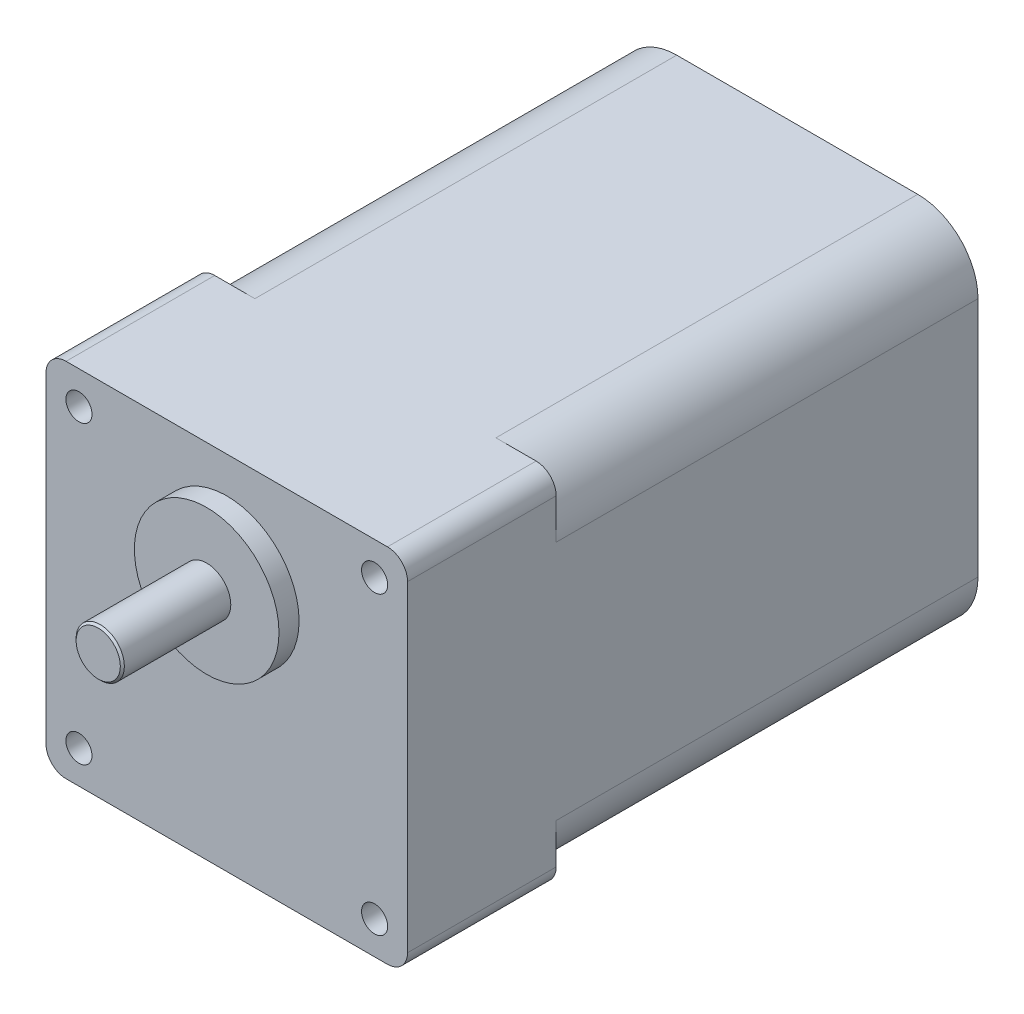
ISO-10303-21;
HEADER;
FILE_DESCRIPTION(('STEP AP214'),'2;1');
FILE_NAME('part.step','',(''),(''),'','','');
FILE_SCHEMA(('AUTOMOTIVE_DESIGN { 1 0 10303 214 1 1 1 1 }'));
ENDSEC;
DATA;
#1=APPLICATION_CONTEXT('core data for automotive mechanical design processes');
#2=APPLICATION_PROTOCOL_DEFINITION('international standard','automotive_design',2000,#1);
#3=PRODUCT_CONTEXT('',#1,'mechanical');
#4=PRODUCT('Part','Part','',(#3));
#5=PRODUCT_RELATED_PRODUCT_CATEGORY('part','',(#4));
#6=PRODUCT_DEFINITION_FORMATION('','',#4);
#7=PRODUCT_DEFINITION_CONTEXT('part definition',#1,'design');
#8=PRODUCT_DEFINITION('design','',#6,#7);
#9=PRODUCT_DEFINITION_SHAPE('','',#8);
#10=(LENGTH_UNIT() NAMED_UNIT(*) SI_UNIT(.MILLI.,.METRE.));
#11=(NAMED_UNIT(*) PLANE_ANGLE_UNIT() SI_UNIT($,.RADIAN.));
#12=(NAMED_UNIT(*) SI_UNIT($,.STERADIAN.) SOLID_ANGLE_UNIT());
#13=UNCERTAINTY_MEASURE_WITH_UNIT(LENGTH_MEASURE(1.E-05),#10,'distance_accuracy_value','');
#14=(GEOMETRIC_REPRESENTATION_CONTEXT(3) GLOBAL_UNCERTAINTY_ASSIGNED_CONTEXT((#13)) GLOBAL_UNIT_ASSIGNED_CONTEXT((#10,
#11,#12)) REPRESENTATION_CONTEXT('',''));
#15=CARTESIAN_POINT('',(0.,0.,0.));
#16=DIRECTION('',(0.,0.,1.));
#17=DIRECTION('',(1.,0.,0.));
#18=AXIS2_PLACEMENT_3D('',#15,#16,#17);
#19=CARTESIAN_POINT('',(0.,0.,0.));
#20=DIRECTION('',(0.,0.,1.));
#21=DIRECTION('',(1.,0.,0.));
#22=AXIS2_PLACEMENT_3D('',#19,#20,#21);
#23=PLANE('',#22);
#24=CARTESIAN_POINT('',(30.,30.,0.));
#25=DIRECTION('',(0.,0.,-1.));
#26=DIRECTION('',(-1.,0.,0.));
#27=AXIS2_PLACEMENT_3D('',#24,#25,#26);
#28=CIRCLE('',#27,15.);
#29=CARTESIAN_POINT('',(30.,45.,0.));
#30=VERTEX_POINT('',#29);
#31=CARTESIAN_POINT('',(45.,30.,0.));
#32=VERTEX_POINT('',#31);
#33=EDGE_CURVE('E58',#30,#32,#28,.T.);
#34=ORIENTED_EDGE('',*,*,#33,.F.);
#35=DIRECTION('',(-1.,0.,0.));
#36=VECTOR('',#35,1.);
#37=CARTESIAN_POINT('',(-45.,45.,0.));
#38=LINE('',#37,#36);
#39=CARTESIAN_POINT('',(40.,45.,0.));
#40=VERTEX_POINT('',#39);
#41=EDGE_CURVE('E257',#40,#30,#38,.T.);
#42=ORIENTED_EDGE('',*,*,#41,.F.);
#43=CARTESIAN_POINT('',(40.,40.,0.));
#44=DIRECTION('',(0.,0.,1.));
#45=DIRECTION('',(1.,0.,0.));
#46=AXIS2_PLACEMENT_3D('',#43,#44,#45);
#47=CIRCLE('',#46,5.);
#48=CARTESIAN_POINT('',(45.,40.,0.));
#49=VERTEX_POINT('',#48);
#50=EDGE_CURVE('E274',#40,#49,#47,.F.);
#51=ORIENTED_EDGE('',*,*,#50,.T.);
#52=DIRECTION('',(0.,1.,0.));
#53=VECTOR('',#52,1.);
#54=CARTESIAN_POINT('',(45.,45.,0.));
#55=LINE('',#54,#53);
#56=EDGE_CURVE('E245',#32,#49,#55,.T.);
#57=ORIENTED_EDGE('',*,*,#56,.F.);
#58=EDGE_LOOP('',(#34,#42,#51,#57));
#59=FACE_BOUND('',#58,.T.);
#60=ADVANCED_FACE('F35',(#59),#23,.F.);
#61=CARTESIAN_POINT('',(-30.,30.,0.));
#62=DIRECTION('',(0.,0.,-1.));
#63=DIRECTION('',(-1.,0.,0.));
#64=AXIS2_PLACEMENT_3D('',#61,#62,#63);
#65=CIRCLE('',#64,15.);
#66=CARTESIAN_POINT('',(-45.,30.,0.));
#67=VERTEX_POINT('',#66);
#68=CARTESIAN_POINT('',(-30.,45.,0.));
#69=VERTEX_POINT('',#68);
#70=EDGE_CURVE('E170',#67,#69,#65,.T.);
#71=ORIENTED_EDGE('',*,*,#70,.F.);
#72=DIRECTION('',(0.,-1.,0.));
#73=VECTOR('',#72,1.);
#74=CARTESIAN_POINT('',(-45.,45.,0.));
#75=LINE('',#74,#73);
#76=CARTESIAN_POINT('',(-45.,40.,0.));
#77=VERTEX_POINT('',#76);
#78=EDGE_CURVE('E261',#77,#67,#75,.T.);
#79=ORIENTED_EDGE('',*,*,#78,.F.);
#80=CARTESIAN_POINT('',(-40.,40.,0.));
#81=DIRECTION('',(0.,0.,1.));
#82=DIRECTION('',(1.,0.,0.));
#83=AXIS2_PLACEMENT_3D('',#80,#81,#82);
#84=CIRCLE('',#83,5.);
#85=CARTESIAN_POINT('',(-40.,45.,0.));
#86=VERTEX_POINT('',#85);
#87=EDGE_CURVE('E277',#77,#86,#84,.F.);
#88=ORIENTED_EDGE('',*,*,#87,.T.);
#89=EDGE_CURVE('E50',#69,#86,#38,.T.);
#90=ORIENTED_EDGE('',*,*,#89,.F.);
#91=EDGE_LOOP('',(#71,#79,#88,#90));
#92=FACE_BOUND('',#91,.T.);
#93=ADVANCED_FACE('F419',(#92),#23,.F.);
#94=CARTESIAN_POINT('',(-30.,-30.,0.));
#95=DIRECTION('',(0.,0.,-1.));
#96=DIRECTION('',(-1.,0.,0.));
#97=AXIS2_PLACEMENT_3D('',#94,#95,#96);
#98=CIRCLE('',#97,15.);
#99=CARTESIAN_POINT('',(-30.,-45.,0.));
#100=VERTEX_POINT('',#99);
#101=CARTESIAN_POINT('',(-45.,-30.,0.));
#102=VERTEX_POINT('',#101);
#103=EDGE_CURVE('E203',#100,#102,#98,.T.);
#104=ORIENTED_EDGE('',*,*,#103,.F.);
#105=DIRECTION('',(1.,0.,0.));
#106=VECTOR('',#105,1.);
#107=CARTESIAN_POINT('',(-45.,-45.,0.));
#108=LINE('',#107,#106);
#109=CARTESIAN_POINT('',(-40.,-45.,0.));
#110=VERTEX_POINT('',#109);
#111=EDGE_CURVE('E265',#110,#100,#108,.T.);
#112=ORIENTED_EDGE('',*,*,#111,.F.);
#113=CARTESIAN_POINT('',(-40.,-40.,0.));
#114=DIRECTION('',(0.,0.,1.));
#115=DIRECTION('',(1.,0.,0.));
#116=AXIS2_PLACEMENT_3D('',#113,#114,#115);
#117=CIRCLE('',#116,5.);
#118=CARTESIAN_POINT('',(-45.,-40.,0.));
#119=VERTEX_POINT('',#118);
#120=EDGE_CURVE('E279',#110,#119,#117,.F.);
#121=ORIENTED_EDGE('',*,*,#120,.T.);
#122=EDGE_CURVE('E259',#102,#119,#75,.T.);
#123=ORIENTED_EDGE('',*,*,#122,.F.);
#124=EDGE_LOOP('',(#104,#112,#121,#123));
#125=FACE_BOUND('',#124,.T.);
#126=ADVANCED_FACE('F322',(#125),#23,.F.);
#127=CARTESIAN_POINT('',(30.,-30.,0.));
#128=DIRECTION('',(0.,0.,-1.));
#129=DIRECTION('',(-1.,0.,0.));
#130=AXIS2_PLACEMENT_3D('',#127,#128,#129);
#131=CIRCLE('',#130,15.);
#132=CARTESIAN_POINT('',(45.,-30.,0.));
#133=VERTEX_POINT('',#132);
#134=CARTESIAN_POINT('',(29.9999999999983,-45.,0.));
#135=VERTEX_POINT('',#134);
#136=EDGE_CURVE('E187',#133,#135,#131,.T.);
#137=ORIENTED_EDGE('',*,*,#136,.F.);
#138=CARTESIAN_POINT('',(45.,-40.,0.));
#139=VERTEX_POINT('',#138);
#140=EDGE_CURVE('E242',#139,#133,#55,.T.);
#141=ORIENTED_EDGE('',*,*,#140,.F.);
#142=CARTESIAN_POINT('',(40.,-40.,0.));
#143=DIRECTION('',(0.,0.,1.));
#144=DIRECTION('',(1.,0.,0.));
#145=AXIS2_PLACEMENT_3D('',#142,#143,#144);
#146=CIRCLE('',#145,5.);
#147=CARTESIAN_POINT('',(40.,-45.,0.));
#148=VERTEX_POINT('',#147);
#149=EDGE_CURVE('E282',#139,#148,#146,.F.);
#150=ORIENTED_EDGE('',*,*,#149,.T.);
#151=EDGE_CURVE('E264',#135,#148,#108,.T.);
#152=ORIENTED_EDGE('',*,*,#151,.F.);
#153=EDGE_LOOP('',(#137,#141,#150,#152));
#154=FACE_BOUND('',#153,.T.);
#155=ADVANCED_FACE('F421',(#154),#23,.F.);
#156=CARTESIAN_POINT('',(0.,18.,42.));
#157=DIRECTION('',(0.,0.,1.));
#158=DIRECTION('',(1.,0.,0.));
#159=AXIS2_PLACEMENT_3D('',#156,#157,#158);
#160=PLANE('',#159);
#161=CARTESIAN_POINT('',(0.,18.,42.));
#162=DIRECTION('',(0.,0.,1.));
#163=DIRECTION('',(1.,0.,0.));
#164=AXIS2_PLACEMENT_3D('',#161,#162,#163);
#165=CIRCLE('',#164,18.);
#166=CARTESIAN_POINT('',(18.,18.,42.));
#167=VERTEX_POINT('',#166);
#168=EDGE_CURVE('E331',#167,#167,#165,.T.);
#169=ORIENTED_EDGE('',*,*,#168,.T.);
#170=EDGE_LOOP('',(#169));
#171=FACE_BOUND('',#170,.T.);
#172=CARTESIAN_POINT('',(0.,18.,42.));
#173=DIRECTION('',(0.,0.,1.));
#174=DIRECTION('',(1.,0.,0.));
#175=AXIS2_PLACEMENT_3D('',#172,#173,#174);
#176=CIRCLE('',#175,6.);
#177=CARTESIAN_POINT('',(6.,18.,42.));
#178=VERTEX_POINT('',#177);
#179=EDGE_CURVE('E173',#178,#178,#176,.T.);
#180=ORIENTED_EDGE('',*,*,#179,.F.);
#181=EDGE_LOOP('',(#180));
#182=FACE_BOUND('',#181,.T.);
#183=ADVANCED_FACE('F395',(#171,#182),#160,.T.);
#184=CARTESIAN_POINT('',(0.,0.,37.));
#185=DIRECTION('',(0.,0.,1.));
#186=DIRECTION('',(1.,0.,0.));
#187=AXIS2_PLACEMENT_3D('',#184,#185,#186);
#188=PLANE('',#187);
#189=CARTESIAN_POINT('',(-36.7999999999979,-36.8,37.));
#190=DIRECTION('',(0.,0.,1.));
#191=DIRECTION('',(1.,0.,0.));
#192=AXIS2_PLACEMENT_3D('',#189,#190,#191);
#193=CIRCLE('',#192,3.2500000000011);
#194=CARTESIAN_POINT('',(-33.5499999999968,-36.8,37.));
#195=VERTEX_POINT('',#194);
#196=EDGE_CURVE('E378',#195,#195,#193,.T.);
#197=ORIENTED_EDGE('',*,*,#196,.F.);
#198=EDGE_LOOP('',(#197));
#199=FACE_BOUND('',#198,.T.);
#200=CARTESIAN_POINT('',(36.8000000000021,-36.7999999999979,37.));
#201=DIRECTION('',(0.,0.,1.));
#202=DIRECTION('',(1.,0.,0.));
#203=AXIS2_PLACEMENT_3D('',#200,#201,#202);
#204=CIRCLE('',#203,3.25000000000292);
#205=CARTESIAN_POINT('',(40.050000000005,-36.7999999999979,37.));
#206=VERTEX_POINT('',#205);
#207=EDGE_CURVE('E372',#206,#206,#204,.T.);
#208=ORIENTED_EDGE('',*,*,#207,.F.);
#209=EDGE_LOOP('',(#208));
#210=FACE_BOUND('',#209,.T.);
#211=CARTESIAN_POINT('',(36.8,36.8000000000021,37.));
#212=DIRECTION('',(0.,0.,1.));
#213=DIRECTION('',(1.,0.,0.));
#214=AXIS2_PLACEMENT_3D('',#211,#212,#213);
#215=CIRCLE('',#214,3.25000000000214);
#216=CARTESIAN_POINT('',(40.0500000000021,36.8000000000021,37.));
#217=VERTEX_POINT('',#216);
#218=EDGE_CURVE('E366',#217,#217,#215,.T.);
#219=ORIENTED_EDGE('',*,*,#218,.F.);
#220=EDGE_LOOP('',(#219));
#221=FACE_BOUND('',#220,.T.);
#222=CARTESIAN_POINT('',(-36.8,36.8,37.));
#223=DIRECTION('',(0.,0.,1.));
#224=DIRECTION('',(1.,0.,0.));
#225=AXIS2_PLACEMENT_3D('',#222,#223,#224);
#226=CIRCLE('',#225,3.25);
#227=CARTESIAN_POINT('',(-33.55,36.8,37.));
#228=VERTEX_POINT('',#227);
#229=EDGE_CURVE('E360',#228,#228,#226,.T.);
#230=ORIENTED_EDGE('',*,*,#229,.F.);
#231=EDGE_LOOP('',(#230));
#232=FACE_BOUND('',#231,.T.);
#233=DIRECTION('',(1.,0.,0.));
#234=VECTOR('',#233,1.);
#235=CARTESIAN_POINT('',(-45.,-45.,37.));
#236=LINE('',#235,#234);
#237=CARTESIAN_POINT('',(-40.,-45.,37.));
#238=VERTEX_POINT('',#237);
#239=CARTESIAN_POINT('',(40.,-45.,37.));
#240=VERTEX_POINT('',#239);
#241=EDGE_CURVE('E249',#238,#240,#236,.T.);
#242=ORIENTED_EDGE('',*,*,#241,.T.);
#243=CARTESIAN_POINT('',(40.,-40.,37.));
#244=DIRECTION('',(0.,0.,1.));
#245=DIRECTION('',(1.,0.,0.));
#246=AXIS2_PLACEMENT_3D('',#243,#244,#245);
#247=CIRCLE('',#246,5.);
#248=CARTESIAN_POINT('',(45.,-40.,37.));
#249=VERTEX_POINT('',#248);
#250=EDGE_CURVE('E296',#240,#249,#247,.T.);
#251=ORIENTED_EDGE('',*,*,#250,.T.);
#252=DIRECTION('',(0.,1.,0.));
#253=VECTOR('',#252,1.);
#254=CARTESIAN_POINT('',(45.,45.,37.));
#255=LINE('',#254,#253);
#256=CARTESIAN_POINT('',(45.,40.,37.));
#257=VERTEX_POINT('',#256);
#258=EDGE_CURVE('E323',#249,#257,#255,.T.);
#259=ORIENTED_EDGE('',*,*,#258,.T.);
#260=CARTESIAN_POINT('',(40.,40.,37.));
#261=DIRECTION('',(0.,0.,1.));
#262=DIRECTION('',(1.,0.,0.));
#263=AXIS2_PLACEMENT_3D('',#260,#261,#262);
#264=CIRCLE('',#263,5.);
#265=CARTESIAN_POINT('',(40.,45.,37.));
#266=VERTEX_POINT('',#265);
#267=EDGE_CURVE('E290',#257,#266,#264,.T.);
#268=ORIENTED_EDGE('',*,*,#267,.T.);
#269=DIRECTION('',(-1.,0.,0.));
#270=VECTOR('',#269,1.);
#271=CARTESIAN_POINT('',(-45.,45.,37.));
#272=LINE('',#271,#270);
#273=CARTESIAN_POINT('',(-40.,45.,37.));
#274=VERTEX_POINT('',#273);
#275=EDGE_CURVE('E315',#266,#274,#272,.T.);
#276=ORIENTED_EDGE('',*,*,#275,.T.);
#277=CARTESIAN_POINT('',(-40.,40.,37.));
#278=DIRECTION('',(0.,0.,1.));
#279=DIRECTION('',(1.,0.,0.));
#280=AXIS2_PLACEMENT_3D('',#277,#278,#279);
#281=CIRCLE('',#280,5.);
#282=CARTESIAN_POINT('',(-45.,40.,37.));
#283=VERTEX_POINT('',#282);
#284=EDGE_CURVE('E292',#274,#283,#281,.T.);
#285=ORIENTED_EDGE('',*,*,#284,.T.);
#286=DIRECTION('',(0.,-1.,0.));
#287=VECTOR('',#286,1.);
#288=CARTESIAN_POINT('',(-45.,45.,37.));
#289=LINE('',#288,#287);
#290=CARTESIAN_POINT('',(-45.,-40.,37.));
#291=VERTEX_POINT('',#290);
#292=EDGE_CURVE('E305',#283,#291,#289,.T.);
#293=ORIENTED_EDGE('',*,*,#292,.T.);
#294=CARTESIAN_POINT('',(-40.,-40.,37.));
#295=DIRECTION('',(0.,0.,1.));
#296=DIRECTION('',(1.,0.,0.));
#297=AXIS2_PLACEMENT_3D('',#294,#295,#296);
#298=CIRCLE('',#297,5.);
#299=EDGE_CURVE('E294',#291,#238,#298,.T.);
#300=ORIENTED_EDGE('',*,*,#299,.T.);
#301=EDGE_LOOP('',(#242,#251,#259,#268,#276,#285,#293,#300));
#302=FACE_BOUND('',#301,.T.);
#303=CARTESIAN_POINT('',(0.,18.,37.));
#304=DIRECTION('',(0.,0.,1.));
#305=DIRECTION('',(1.,0.,0.));
#306=AXIS2_PLACEMENT_3D('',#303,#304,#305);
#307=CIRCLE('',#306,18.);
#308=CARTESIAN_POINT('',(18.,18.,37.));
#309=VERTEX_POINT('',#308);
#310=EDGE_CURVE('E176',#309,#309,#307,.T.);
#311=ORIENTED_EDGE('',*,*,#310,.F.);
#312=EDGE_LOOP('',(#311));
#313=FACE_BOUND('',#312,.T.);
#314=ADVANCED_FACE('F311',(#199,#210,#221,#232,#302,#313),#188,.T.);
#315=CARTESIAN_POINT('',(45.,45.,37.));
#316=DIRECTION('',(-1.,0.,0.));
#317=DIRECTION('',(0.,-1.,0.));
#318=AXIS2_PLACEMENT_3D('',#315,#316,#317);
#319=PLANE('',#318);
#320=ORIENTED_EDGE('',*,*,#258,.F.);
#321=DIRECTION('',(0.,0.,-1.));
#322=VECTOR('',#321,1.);
#323=CARTESIAN_POINT('',(45.,-40.,37.));
#324=LINE('',#323,#322);
#325=EDGE_CURVE('E271',#249,#139,#324,.T.);
#326=ORIENTED_EDGE('',*,*,#325,.T.);
#327=ORIENTED_EDGE('',*,*,#140,.T.);
#328=DIRECTION('',(0.,0.,1.));
#329=VECTOR('',#328,1.);
#330=CARTESIAN_POINT('',(45.,-30.0000000000002,-105.));
#331=LINE('',#330,#329);
#332=CARTESIAN_POINT('',(45.,-30.0000000000002,-105.));
#333=VERTEX_POINT('',#332);
#334=EDGE_CURVE('E157',#333,#133,#331,.T.);
#335=ORIENTED_EDGE('',*,*,#334,.F.);
#336=DIRECTION('',(0.,-1.,0.));
#337=VECTOR('',#336,1.);
#338=CARTESIAN_POINT('',(45.,29.9999999999986,-105.));
#339=LINE('',#338,#337);
#340=CARTESIAN_POINT('',(45.,29.9999999999986,-105.));
#341=VERTEX_POINT('',#340);
#342=EDGE_CURVE('E149',#341,#333,#339,.T.);
#343=ORIENTED_EDGE('',*,*,#342,.F.);
#344=DIRECTION('',(0.,0.,1.));
#345=VECTOR('',#344,1.);
#346=CARTESIAN_POINT('',(45.,29.9999999999986,-105.));
#347=LINE('',#346,#345);
#348=EDGE_CURVE('E154',#341,#32,#347,.T.);
#349=ORIENTED_EDGE('',*,*,#348,.T.);
#350=ORIENTED_EDGE('',*,*,#56,.T.);
#351=DIRECTION('',(0.,0.,-1.));
#352=VECTOR('',#351,1.);
#353=CARTESIAN_POINT('',(45.,40.,37.));
#354=LINE('',#353,#352);
#355=EDGE_CURVE('E268',#49,#257,#354,.F.);
#356=ORIENTED_EDGE('',*,*,#355,.T.);
#357=EDGE_LOOP('',(#320,#326,#327,#335,#343,#349,#350,#356));
#358=FACE_BOUND('',#357,.T.);
#359=ADVANCED_FACE('F152',(#358),#319,.F.);
#360=CARTESIAN_POINT('',(-45.,45.,37.));
#361=DIRECTION('',(0.,-1.,0.));
#362=DIRECTION('',(0.,0.,-1.));
#363=AXIS2_PLACEMENT_3D('',#360,#361,#362);
#364=PLANE('',#363);
#365=ORIENTED_EDGE('',*,*,#41,.T.);
#366=DIRECTION('',(0.,0.,1.));
#367=VECTOR('',#366,1.);
#368=CARTESIAN_POINT('',(30.,45.,-105.));
#369=LINE('',#368,#367);
#370=CARTESIAN_POINT('',(30.,45.,-105.));
#371=VERTEX_POINT('',#370);
#372=EDGE_CURVE('E189',#371,#30,#369,.T.);
#373=ORIENTED_EDGE('',*,*,#372,.F.);
#374=DIRECTION('',(1.,0.,0.));
#375=VECTOR('',#374,1.);
#376=CARTESIAN_POINT('',(30.,45.,-105.));
#377=LINE('',#376,#375);
#378=CARTESIAN_POINT('',(-29.9999999999986,45.,-105.));
#379=VERTEX_POINT('',#378);
#380=EDGE_CURVE('E166',#379,#371,#377,.T.);
#381=ORIENTED_EDGE('',*,*,#380,.F.);
#382=DIRECTION('',(0.,0.,1.));
#383=VECTOR('',#382,1.);
#384=CARTESIAN_POINT('',(-29.9999999999986,45.,-105.));
#385=LINE('',#384,#383);
#386=EDGE_CURVE('E337',#379,#69,#385,.T.);
#387=ORIENTED_EDGE('',*,*,#386,.T.);
#388=ORIENTED_EDGE('',*,*,#89,.T.);
#389=DIRECTION('',(0.,0.,-1.));
#390=VECTOR('',#389,1.);
#391=CARTESIAN_POINT('',(-40.,45.,37.));
#392=LINE('',#391,#390);
#393=EDGE_CURVE('E228',#86,#274,#392,.F.);
#394=ORIENTED_EDGE('',*,*,#393,.T.);
#395=ORIENTED_EDGE('',*,*,#275,.F.);
#396=DIRECTION('',(0.,0.,-1.));
#397=VECTOR('',#396,1.);
#398=CARTESIAN_POINT('',(40.,45.,37.));
#399=LINE('',#398,#397);
#400=EDGE_CURVE('E231',#266,#40,#399,.T.);
#401=ORIENTED_EDGE('',*,*,#400,.T.);
#402=EDGE_LOOP('',(#365,#373,#381,#387,#388,#394,#395,#401));
#403=FACE_BOUND('',#402,.T.);
#404=ADVANCED_FACE('F485',(#403),#364,.F.);
#405=CARTESIAN_POINT('',(-45.,45.,37.));
#406=DIRECTION('',(1.,0.,0.));
#407=DIRECTION('',(0.,1.,0.));
#408=AXIS2_PLACEMENT_3D('',#405,#406,#407);
#409=PLANE('',#408);
#410=ORIENTED_EDGE('',*,*,#78,.T.);
#411=DIRECTION('',(0.,0.,1.));
#412=VECTOR('',#411,1.);
#413=CARTESIAN_POINT('',(-45.,30.0000000000002,-105.));
#414=LINE('',#413,#412);
#415=CARTESIAN_POINT('',(-45.,30.0000000000002,-105.));
#416=VERTEX_POINT('',#415);
#417=EDGE_CURVE('E221',#416,#67,#414,.T.);
#418=ORIENTED_EDGE('',*,*,#417,.F.);
#419=DIRECTION('',(0.,1.,0.));
#420=VECTOR('',#419,1.);
#421=CARTESIAN_POINT('',(-45.,30.0000000000002,-105.));
#422=LINE('',#421,#420);
#423=CARTESIAN_POINT('',(-45.,-29.9999999999986,-105.));
#424=VERTEX_POINT('',#423);
#425=EDGE_CURVE('E350',#424,#416,#422,.T.);
#426=ORIENTED_EDGE('',*,*,#425,.F.);
#427=DIRECTION('',(0.,0.,1.));
#428=VECTOR('',#427,1.);
#429=CARTESIAN_POINT('',(-45.,-29.9999999999986,-105.));
#430=LINE('',#429,#428);
#431=EDGE_CURVE('E214',#424,#102,#430,.T.);
#432=ORIENTED_EDGE('',*,*,#431,.T.);
#433=ORIENTED_EDGE('',*,*,#122,.T.);
#434=DIRECTION('',(0.,0.,-1.));
#435=VECTOR('',#434,1.);
#436=CARTESIAN_POINT('',(-45.,-40.,37.));
#437=LINE('',#436,#435);
#438=EDGE_CURVE('E238',#119,#291,#437,.F.);
#439=ORIENTED_EDGE('',*,*,#438,.T.);
#440=ORIENTED_EDGE('',*,*,#292,.F.);
#441=DIRECTION('',(0.,0.,-1.));
#442=VECTOR('',#441,1.);
#443=CARTESIAN_POINT('',(-45.,40.,37.));
#444=LINE('',#443,#442);
#445=EDGE_CURVE('E298',#283,#77,#444,.T.);
#446=ORIENTED_EDGE('',*,*,#445,.T.);
#447=EDGE_LOOP('',(#410,#418,#426,#432,#433,#439,#440,#446));
#448=FACE_BOUND('',#447,.T.);
#449=ADVANCED_FACE('F304',(#448),#409,.F.);
#450=CARTESIAN_POINT('',(-45.,-45.,37.));
#451=DIRECTION('',(0.,1.,0.));
#452=DIRECTION('',(0.,0.,1.));
#453=AXIS2_PLACEMENT_3D('',#450,#451,#452);
#454=PLANE('',#453);
#455=ORIENTED_EDGE('',*,*,#111,.T.);
#456=DIRECTION('',(0.,0.,1.));
#457=VECTOR('',#456,1.);
#458=CARTESIAN_POINT('',(-30.0000000000002,-45.,-105.));
#459=LINE('',#458,#457);
#460=CARTESIAN_POINT('',(-30.0000000000002,-45.,-105.));
#461=VERTEX_POINT('',#460);
#462=EDGE_CURVE('E208',#461,#100,#459,.T.);
#463=ORIENTED_EDGE('',*,*,#462,.F.);
#464=DIRECTION('',(-1.,0.,0.));
#465=VECTOR('',#464,1.);
#466=CARTESIAN_POINT('',(29.9999999999983,-45.,-105.));
#467=LINE('',#466,#465);
#468=CARTESIAN_POINT('',(29.9999999999983,-45.,-105.));
#469=VERTEX_POINT('',#468);
#470=EDGE_CURVE('E355',#469,#461,#467,.T.);
#471=ORIENTED_EDGE('',*,*,#470,.F.);
#472=DIRECTION('',(0.,0.,1.));
#473=VECTOR('',#472,1.);
#474=CARTESIAN_POINT('',(29.9999999999983,-45.,-105.));
#475=LINE('',#474,#473);
#476=EDGE_CURVE('E178',#469,#135,#475,.T.);
#477=ORIENTED_EDGE('',*,*,#476,.T.);
#478=ORIENTED_EDGE('',*,*,#151,.T.);
#479=DIRECTION('',(0.,0.,-1.));
#480=VECTOR('',#479,1.);
#481=CARTESIAN_POINT('',(40.,-45.,37.));
#482=LINE('',#481,#480);
#483=EDGE_CURVE('E288',#148,#240,#482,.F.);
#484=ORIENTED_EDGE('',*,*,#483,.T.);
#485=ORIENTED_EDGE('',*,*,#241,.F.);
#486=DIRECTION('',(0.,0.,-1.));
#487=VECTOR('',#486,1.);
#488=CARTESIAN_POINT('',(-40.,-45.,37.));
#489=LINE('',#488,#487);
#490=EDGE_CURVE('E285',#238,#110,#489,.T.);
#491=ORIENTED_EDGE('',*,*,#490,.T.);
#492=EDGE_LOOP('',(#455,#463,#471,#477,#478,#484,#485,#491));
#493=FACE_BOUND('',#492,.T.);
#494=ADVANCED_FACE('F320',(#493),#454,.F.);
#495=CARTESIAN_POINT('',(40.,-40.,37.));
#496=DIRECTION('',(0.,0.,-1.));
#497=DIRECTION('',(-1.,0.,0.));
#498=AXIS2_PLACEMENT_3D('',#495,#496,#497);
#499=CYLINDRICAL_SURFACE('',#498,5.);
#500=ORIENTED_EDGE('',*,*,#250,.F.);
#501=ORIENTED_EDGE('',*,*,#483,.F.);
#502=ORIENTED_EDGE('',*,*,#149,.F.);
#503=ORIENTED_EDGE('',*,*,#325,.F.);
#504=EDGE_LOOP('',(#500,#501,#502,#503));
#505=FACE_BOUND('',#504,.T.);
#506=ADVANCED_FACE('F479',(#505),#499,.T.);
#507=CARTESIAN_POINT('',(-40.,-40.,37.));
#508=DIRECTION('',(0.,0.,-1.));
#509=DIRECTION('',(-1.,0.,0.));
#510=AXIS2_PLACEMENT_3D('',#507,#508,#509);
#511=CYLINDRICAL_SURFACE('',#510,5.);
#512=ORIENTED_EDGE('',*,*,#299,.F.);
#513=ORIENTED_EDGE('',*,*,#438,.F.);
#514=ORIENTED_EDGE('',*,*,#120,.F.);
#515=ORIENTED_EDGE('',*,*,#490,.F.);
#516=EDGE_LOOP('',(#512,#513,#514,#515));
#517=FACE_BOUND('',#516,.T.);
#518=ADVANCED_FACE('F317',(#517),#511,.T.);
#519=CARTESIAN_POINT('',(-40.,40.,37.));
#520=DIRECTION('',(0.,0.,-1.));
#521=DIRECTION('',(-1.,0.,0.));
#522=AXIS2_PLACEMENT_3D('',#519,#520,#521);
#523=CYLINDRICAL_SURFACE('',#522,5.);
#524=ORIENTED_EDGE('',*,*,#284,.F.);
#525=ORIENTED_EDGE('',*,*,#393,.F.);
#526=ORIENTED_EDGE('',*,*,#87,.F.);
#527=ORIENTED_EDGE('',*,*,#445,.F.);
#528=EDGE_LOOP('',(#524,#525,#526,#527));
#529=FACE_BOUND('',#528,.T.);
#530=ADVANCED_FACE('F463',(#529),#523,.T.);
#531=CARTESIAN_POINT('',(40.,40.,37.));
#532=DIRECTION('',(0.,0.,-1.));
#533=DIRECTION('',(-1.,0.,0.));
#534=AXIS2_PLACEMENT_3D('',#531,#532,#533);
#535=CYLINDRICAL_SURFACE('',#534,5.);
#536=ORIENTED_EDGE('',*,*,#267,.F.);
#537=ORIENTED_EDGE('',*,*,#355,.F.);
#538=ORIENTED_EDGE('',*,*,#50,.F.);
#539=ORIENTED_EDGE('',*,*,#400,.F.);
#540=EDGE_LOOP('',(#536,#537,#538,#539));
#541=FACE_BOUND('',#540,.T.);
#542=ADVANCED_FACE('F458',(#541),#535,.T.);
#543=CARTESIAN_POINT('',(0.,18.,42.));
#544=DIRECTION('',(0.,0.,-1.));
#545=DIRECTION('',(-1.,0.,0.));
#546=AXIS2_PLACEMENT_3D('',#543,#544,#545);
#547=CYLINDRICAL_SURFACE('',#546,18.);
#548=ORIENTED_EDGE('',*,*,#168,.F.);
#549=EDGE_LOOP('',(#548));
#550=FACE_BOUND('',#549,.T.);
#551=ORIENTED_EDGE('',*,*,#310,.T.);
#552=EDGE_LOOP('',(#551));
#553=FACE_BOUND('',#552,.T.);
#554=ADVANCED_FACE('F454',(#550,#553),#547,.T.);
#555=CARTESIAN_POINT('',(0.,18.,69.));
#556=DIRECTION('',(0.,0.,-1.));
#557=DIRECTION('',(-1.,0.,0.));
#558=AXIS2_PLACEMENT_3D('',#555,#556,#557);
#559=CYLINDRICAL_SURFACE('',#558,6.);
#560=CARTESIAN_POINT('',(0.,18.,68.5));
#561=DIRECTION('',(0.,0.,1.));
#562=DIRECTION('',(1.,0.,0.));
#563=AXIS2_PLACEMENT_3D('',#560,#561,#562);
#564=CIRCLE('',#563,6.);
#565=CARTESIAN_POINT('',(6.,18.,68.5));
#566=VERTEX_POINT('',#565);
#567=EDGE_CURVE('E11',#566,#566,#564,.F.);
#568=ORIENTED_EDGE('',*,*,#567,.T.);
#569=EDGE_LOOP('',(#568));
#570=FACE_BOUND('',#569,.T.);
#571=ORIENTED_EDGE('',*,*,#179,.T.);
#572=EDGE_LOOP('',(#571));
#573=FACE_BOUND('',#572,.T.);
#574=ADVANCED_FACE('F452',(#570,#573),#559,.T.);
#575=CARTESIAN_POINT('',(0.,18.,69.));
#576=DIRECTION('',(0.,0.,1.));
#577=DIRECTION('',(1.,0.,0.));
#578=AXIS2_PLACEMENT_3D('',#575,#576,#577);
#579=PLANE('',#578);
#580=CARTESIAN_POINT('',(0.,18.,69.));
#581=DIRECTION('',(0.,0.,1.));
#582=DIRECTION('',(1.,0.,0.));
#583=AXIS2_PLACEMENT_3D('',#580,#581,#582);
#584=CIRCLE('',#583,5.50000000000001);
#585=CARTESIAN_POINT('',(5.50000000000001,18.,69.));
#586=VERTEX_POINT('',#585);
#587=EDGE_CURVE('E43',#586,#586,#584,.T.);
#588=ORIENTED_EDGE('',*,*,#587,.T.);
#589=EDGE_LOOP('',(#588));
#590=FACE_BOUND('',#589,.T.);
#591=ADVANCED_FACE('F446',(#590),#579,.T.);
#592=CARTESIAN_POINT('',(30.,30.,-105.));
#593=DIRECTION('',(0.,0.,1.));
#594=DIRECTION('',(1.,0.,0.));
#595=AXIS2_PLACEMENT_3D('',#592,#593,#594);
#596=CYLINDRICAL_SURFACE('',#595,15.);
#597=ORIENTED_EDGE('',*,*,#33,.T.);
#598=ORIENTED_EDGE('',*,*,#348,.F.);
#599=CARTESIAN_POINT('',(30.,30.,-105.));
#600=DIRECTION('',(0.,0.,-1.));
#601=DIRECTION('',(-1.,0.,0.));
#602=AXIS2_PLACEMENT_3D('',#599,#600,#601);
#603=CIRCLE('',#602,15.);
#604=EDGE_CURVE('E161',#371,#341,#603,.T.);
#605=ORIENTED_EDGE('',*,*,#604,.F.);
#606=ORIENTED_EDGE('',*,*,#372,.T.);
#607=EDGE_LOOP('',(#597,#598,#605,#606));
#608=FACE_BOUND('',#607,.T.);
#609=ADVANCED_FACE('F172',(#608),#596,.T.);
#610=CARTESIAN_POINT('',(30.,-30.,-105.));
#611=DIRECTION('',(0.,0.,1.));
#612=DIRECTION('',(1.,0.,0.));
#613=AXIS2_PLACEMENT_3D('',#610,#611,#612);
#614=CYLINDRICAL_SURFACE('',#613,15.);
#615=ORIENTED_EDGE('',*,*,#136,.T.);
#616=ORIENTED_EDGE('',*,*,#476,.F.);
#617=CARTESIAN_POINT('',(30.,-30.,-105.));
#618=DIRECTION('',(0.,0.,-1.));
#619=DIRECTION('',(-1.,0.,0.));
#620=AXIS2_PLACEMENT_3D('',#617,#618,#619);
#621=CIRCLE('',#620,15.);
#622=EDGE_CURVE('E160',#333,#469,#621,.T.);
#623=ORIENTED_EDGE('',*,*,#622,.F.);
#624=ORIENTED_EDGE('',*,*,#334,.T.);
#625=EDGE_LOOP('',(#615,#616,#623,#624));
#626=FACE_BOUND('',#625,.T.);
#627=ADVANCED_FACE('F437',(#626),#614,.T.);
#628=CARTESIAN_POINT('',(-30.,-30.,-105.));
#629=DIRECTION('',(0.,0.,1.));
#630=DIRECTION('',(1.,0.,0.));
#631=AXIS2_PLACEMENT_3D('',#628,#629,#630);
#632=CYLINDRICAL_SURFACE('',#631,15.);
#633=ORIENTED_EDGE('',*,*,#103,.T.);
#634=ORIENTED_EDGE('',*,*,#431,.F.);
#635=CARTESIAN_POINT('',(-30.,-30.,-105.));
#636=DIRECTION('',(0.,0.,-1.));
#637=DIRECTION('',(-1.,0.,0.));
#638=AXIS2_PLACEMENT_3D('',#635,#636,#637);
#639=CIRCLE('',#638,15.);
#640=EDGE_CURVE('E353',#461,#424,#639,.T.);
#641=ORIENTED_EDGE('',*,*,#640,.F.);
#642=ORIENTED_EDGE('',*,*,#462,.T.);
#643=EDGE_LOOP('',(#633,#634,#641,#642));
#644=FACE_BOUND('',#643,.T.);
#645=ADVANCED_FACE('F347',(#644),#632,.T.);
#646=CARTESIAN_POINT('',(-30.,30.,-105.));
#647=DIRECTION('',(0.,0.,1.));
#648=DIRECTION('',(1.,0.,0.));
#649=AXIS2_PLACEMENT_3D('',#646,#647,#648);
#650=CYLINDRICAL_SURFACE('',#649,15.);
#651=ORIENTED_EDGE('',*,*,#70,.T.);
#652=ORIENTED_EDGE('',*,*,#386,.F.);
#653=CARTESIAN_POINT('',(-30.,30.,-105.));
#654=DIRECTION('',(0.,0.,-1.));
#655=DIRECTION('',(-1.,0.,0.));
#656=AXIS2_PLACEMENT_3D('',#653,#654,#655);
#657=CIRCLE('',#656,15.);
#658=EDGE_CURVE('E352',#416,#379,#657,.T.);
#659=ORIENTED_EDGE('',*,*,#658,.F.);
#660=ORIENTED_EDGE('',*,*,#417,.T.);
#661=EDGE_LOOP('',(#651,#652,#659,#660));
#662=FACE_BOUND('',#661,.T.);
#663=ADVANCED_FACE('F444',(#662),#650,.T.);
#664=CARTESIAN_POINT('',(30.,30.,-105.));
#665=DIRECTION('',(0.,0.,-1.));
#666=DIRECTION('',(-1.,0.,0.));
#667=AXIS2_PLACEMENT_3D('',#664,#665,#666);
#668=PLANE('',#667);
#669=ORIENTED_EDGE('',*,*,#604,.T.);
#670=ORIENTED_EDGE('',*,*,#342,.T.);
#671=ORIENTED_EDGE('',*,*,#622,.T.);
#672=ORIENTED_EDGE('',*,*,#470,.T.);
#673=ORIENTED_EDGE('',*,*,#640,.T.);
#674=ORIENTED_EDGE('',*,*,#425,.T.);
#675=ORIENTED_EDGE('',*,*,#658,.T.);
#676=ORIENTED_EDGE('',*,*,#380,.T.);
#677=EDGE_LOOP('',(#669,#670,#671,#672,#673,#674,#675,#676));
#678=FACE_BOUND('',#677,.T.);
#679=ADVANCED_FACE('F164',(#678),#668,.T.);
#680=CARTESIAN_POINT('',(0.,18.,69.));
#681=DIRECTION('',(0.,0.,-1.));
#682=DIRECTION('',(-1.,0.,0.));
#683=AXIS2_PLACEMENT_3D('',#680,#681,#682);
#684=CONICAL_SURFACE('',#683,5.50000000000001,0.785398163397458);
#685=ORIENTED_EDGE('',*,*,#567,.F.);
#686=EDGE_LOOP('',(#685));
#687=FACE_BOUND('',#686,.T.);
#688=ORIENTED_EDGE('',*,*,#587,.F.);
#689=EDGE_LOOP('',(#688));
#690=FACE_BOUND('',#689,.T.);
#691=ADVANCED_FACE('F37',(#687,#690),#684,.T.);
#692=CARTESIAN_POINT('',(-36.8,36.8,-7.5));
#693=DIRECTION('',(0.,0.,1.));
#694=DIRECTION('',(1.,0.,0.));
#695=AXIS2_PLACEMENT_3D('',#692,#693,#694);
#696=CYLINDRICAL_SURFACE('',#695,3.25);
#697=CARTESIAN_POINT('',(-36.8,36.8,-7.5));
#698=DIRECTION('',(0.,0.,1.));
#699=DIRECTION('',(1.,0.,0.));
#700=AXIS2_PLACEMENT_3D('',#697,#698,#699);
#701=CIRCLE('',#700,3.25);
#702=CARTESIAN_POINT('',(-33.55,36.8,-7.5));
#703=VERTEX_POINT('',#702);
#704=EDGE_CURVE('E188',#703,#703,#701,.T.);
#705=ORIENTED_EDGE('',*,*,#704,.F.);
#706=EDGE_LOOP('',(#705));
#707=FACE_BOUND('',#706,.T.);
#708=ORIENTED_EDGE('',*,*,#229,.T.);
#709=EDGE_LOOP('',(#708));
#710=FACE_BOUND('',#709,.T.);
#711=ADVANCED_FACE('F403',(#707,#710),#696,.F.);
#712=CARTESIAN_POINT('',(-36.8,36.8,-7.5));
#713=DIRECTION('',(0.,0.,1.));
#714=DIRECTION('',(1.,0.,0.));
#715=AXIS2_PLACEMENT_3D('',#712,#713,#714);
#716=PLANE('',#715);
#717=ORIENTED_EDGE('',*,*,#704,.T.);
#718=EDGE_LOOP('',(#717));
#719=FACE_BOUND('',#718,.T.);
#720=ADVANCED_FACE('F405',(#719),#716,.T.);
#721=CARTESIAN_POINT('',(36.8,36.8000000000021,-7.5));
#722=DIRECTION('',(0.,0.,1.));
#723=DIRECTION('',(1.,0.,0.));
#724=AXIS2_PLACEMENT_3D('',#721,#722,#723);
#725=CYLINDRICAL_SURFACE('',#724,3.25000000000214);
#726=CARTESIAN_POINT('',(36.8,36.8000000000021,-7.5));
#727=DIRECTION('',(0.,0.,1.));
#728=DIRECTION('',(1.,0.,0.));
#729=AXIS2_PLACEMENT_3D('',#726,#727,#728);
#730=CIRCLE('',#729,3.25000000000214);
#731=CARTESIAN_POINT('',(40.0500000000021,36.8000000000021,-7.5));
#732=VERTEX_POINT('',#731);
#733=EDGE_CURVE('E363',#732,#732,#730,.T.);
#734=ORIENTED_EDGE('',*,*,#733,.F.);
#735=EDGE_LOOP('',(#734));
#736=FACE_BOUND('',#735,.T.);
#737=ORIENTED_EDGE('',*,*,#218,.T.);
#738=EDGE_LOOP('',(#737));
#739=FACE_BOUND('',#738,.T.);
#740=ADVANCED_FACE('F412',(#736,#739),#725,.F.);
#741=CARTESIAN_POINT('',(36.8,36.8000000000021,-7.5));
#742=DIRECTION('',(0.,0.,1.));
#743=DIRECTION('',(1.,0.,0.));
#744=AXIS2_PLACEMENT_3D('',#741,#742,#743);
#745=PLANE('',#744);
#746=ORIENTED_EDGE('',*,*,#733,.T.);
#747=EDGE_LOOP('',(#746));
#748=FACE_BOUND('',#747,.T.);
#749=ADVANCED_FACE('F623',(#748),#745,.T.);
#750=CARTESIAN_POINT('',(36.8000000000021,-36.7999999999979,-7.5));
#751=DIRECTION('',(0.,0.,1.));
#752=DIRECTION('',(1.,0.,0.));
#753=AXIS2_PLACEMENT_3D('',#750,#751,#752);
#754=CYLINDRICAL_SURFACE('',#753,3.25000000000292);
#755=CARTESIAN_POINT('',(36.8000000000021,-36.7999999999979,-7.5));
#756=DIRECTION('',(0.,0.,1.));
#757=DIRECTION('',(1.,0.,0.));
#758=AXIS2_PLACEMENT_3D('',#755,#756,#757);
#759=CIRCLE('',#758,3.25000000000292);
#760=CARTESIAN_POINT('',(40.050000000005,-36.7999999999979,-7.5));
#761=VERTEX_POINT('',#760);
#762=EDGE_CURVE('E369',#761,#761,#759,.T.);
#763=ORIENTED_EDGE('',*,*,#762,.F.);
#764=EDGE_LOOP('',(#763));
#765=FACE_BOUND('',#764,.T.);
#766=ORIENTED_EDGE('',*,*,#207,.T.);
#767=EDGE_LOOP('',(#766));
#768=FACE_BOUND('',#767,.T.);
#769=ADVANCED_FACE('F632',(#765,#768),#754,.F.);
#770=CARTESIAN_POINT('',(36.8000000000021,-36.7999999999979,-7.5));
#771=DIRECTION('',(0.,0.,1.));
#772=DIRECTION('',(1.,0.,0.));
#773=AXIS2_PLACEMENT_3D('',#770,#771,#772);
#774=PLANE('',#773);
#775=ORIENTED_EDGE('',*,*,#762,.T.);
#776=EDGE_LOOP('',(#775));
#777=FACE_BOUND('',#776,.T.);
#778=ADVANCED_FACE('F389',(#777),#774,.T.);
#779=CARTESIAN_POINT('',(-36.7999999999979,-36.8,-7.5));
#780=DIRECTION('',(0.,0.,1.));
#781=DIRECTION('',(1.,0.,0.));
#782=AXIS2_PLACEMENT_3D('',#779,#780,#781);
#783=CYLINDRICAL_SURFACE('',#782,3.2500000000011);
#784=CARTESIAN_POINT('',(-36.7999999999979,-36.8,-7.5));
#785=DIRECTION('',(0.,0.,1.));
#786=DIRECTION('',(1.,0.,0.));
#787=AXIS2_PLACEMENT_3D('',#784,#785,#786);
#788=CIRCLE('',#787,3.2500000000011);
#789=CARTESIAN_POINT('',(-33.5499999999968,-36.8,-7.5));
#790=VERTEX_POINT('',#789);
#791=EDGE_CURVE('E375',#790,#790,#788,.T.);
#792=ORIENTED_EDGE('',*,*,#791,.F.);
#793=EDGE_LOOP('',(#792));
#794=FACE_BOUND('',#793,.T.);
#795=ORIENTED_EDGE('',*,*,#196,.T.);
#796=EDGE_LOOP('',(#795));
#797=FACE_BOUND('',#796,.T.);
#798=ADVANCED_FACE('F386',(#794,#797),#783,.F.);
#799=CARTESIAN_POINT('',(-36.7999999999979,-36.8,-7.5));
#800=DIRECTION('',(0.,0.,1.));
#801=DIRECTION('',(1.,0.,0.));
#802=AXIS2_PLACEMENT_3D('',#799,#800,#801);
#803=PLANE('',#802);
#804=ORIENTED_EDGE('',*,*,#791,.T.);
#805=EDGE_LOOP('',(#804));
#806=FACE_BOUND('',#805,.T.);
#807=ADVANCED_FACE('F384',(#806),#803,.T.);
#808=CLOSED_SHELL('',(#60,#93,#126,#155,#183,#314,#359,#404,#449,#494,#506,#518,#530,#542,#554,
#574,#591,#609,#627,#645,#663,#679,#691,#711,#720,#740,#749,#769,#778,#798,#807));
#809=MANIFOLD_SOLID_BREP('B2',#808);
#810=ADVANCED_BREP_SHAPE_REPRESENTATION('',(#18,#809),#14);
#811=SHAPE_DEFINITION_REPRESENTATION(#9,#810);
ENDSEC;
END-ISO-10303-21;
